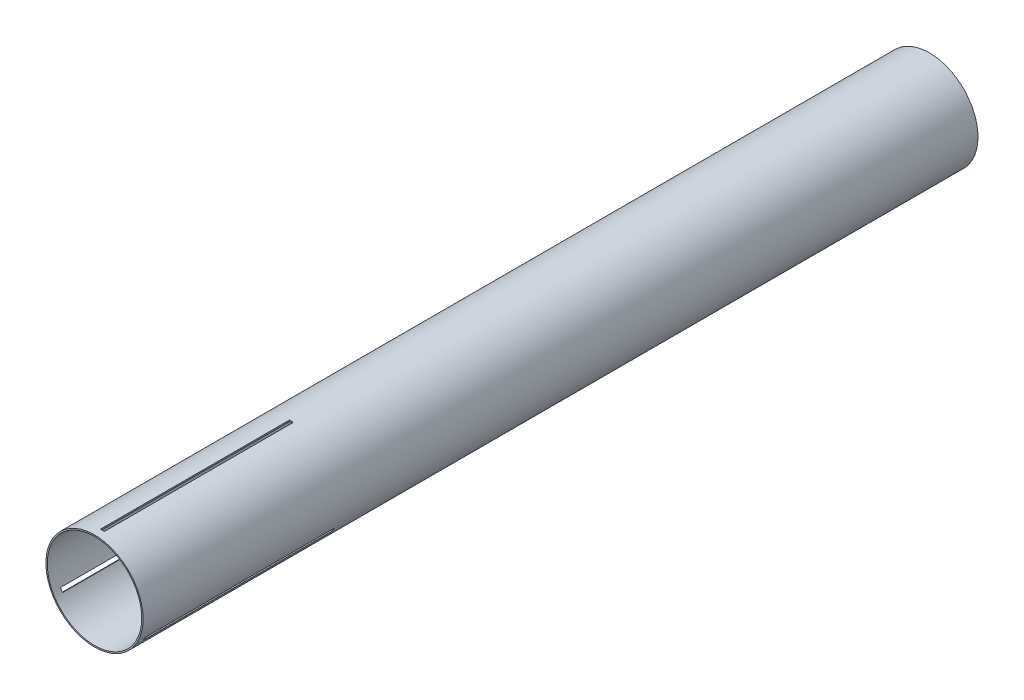
ISO-10303-21;
HEADER;
FILE_DESCRIPTION(('STEP AP214'),'2;1');
FILE_NAME('part.step','',(''),(''),'','','');
FILE_SCHEMA(('AUTOMOTIVE_DESIGN { 1 0 10303 214 1 1 1 1 }'));
ENDSEC;
DATA;
#1=APPLICATION_CONTEXT('core data for automotive mechanical design processes');
#2=APPLICATION_PROTOCOL_DEFINITION('international standard','automotive_design',2000,#1);
#3=PRODUCT_CONTEXT('',#1,'mechanical');
#4=PRODUCT('Part','Part','',(#3));
#5=PRODUCT_RELATED_PRODUCT_CATEGORY('part','',(#4));
#6=PRODUCT_DEFINITION_FORMATION('','',#4);
#7=PRODUCT_DEFINITION_CONTEXT('part definition',#1,'design');
#8=PRODUCT_DEFINITION('design','',#6,#7);
#9=PRODUCT_DEFINITION_SHAPE('','',#8);
#10=(LENGTH_UNIT() NAMED_UNIT(*) SI_UNIT(.MILLI.,.METRE.));
#11=(NAMED_UNIT(*) PLANE_ANGLE_UNIT() SI_UNIT($,.RADIAN.));
#12=(NAMED_UNIT(*) SI_UNIT($,.STERADIAN.) SOLID_ANGLE_UNIT());
#13=UNCERTAINTY_MEASURE_WITH_UNIT(LENGTH_MEASURE(1.E-05),#10,'distance_accuracy_value','');
#14=(GEOMETRIC_REPRESENTATION_CONTEXT(3) GLOBAL_UNCERTAINTY_ASSIGNED_CONTEXT((#13)) GLOBAL_UNIT_ASSIGNED_CONTEXT((#10,
#11,#12)) REPRESENTATION_CONTEXT('',''));
#15=CARTESIAN_POINT('',(0.,0.,0.));
#16=DIRECTION('',(0.,0.,1.));
#17=DIRECTION('',(1.,0.,0.));
#18=AXIS2_PLACEMENT_3D('',#15,#16,#17);
#19=CARTESIAN_POINT('',(0.,0.,1346.2));
#20=DIRECTION('',(0.,0.,-1.));
#21=DIRECTION('',(-1.,0.,0.));
#22=AXIS2_PLACEMENT_3D('',#19,#20,#21);
#23=CYLINDRICAL_SURFACE('',#22,78.359);
#24=DIRECTION('',(0.,0.,-1.));
#25=VECTOR('',#24,1.);
#26=CARTESIAN_POINT('',(66.2176560871294,-41.8969557763647,1346.2));
#27=LINE('',#26,#25);
#28=CARTESIAN_POINT('',(66.2176560871293,-41.8969557763647,1028.7));
#29=VERTEX_POINT('',#28);
#30=CARTESIAN_POINT('',(66.2176560871293,-41.8969557763647,1333.5));
#31=VERTEX_POINT('',#30);
#32=EDGE_CURVE('E159',#29,#31,#27,.F.);
#33=ORIENTED_EDGE('',*,*,#32,.T.);
#34=CARTESIAN_POINT('',(0.,0.,1333.5));
#35=DIRECTION('',(0.,0.,1.));
#36=DIRECTION('',(1.,0.,0.));
#37=AXIS2_PLACEMENT_3D('',#34,#35,#36);
#38=CIRCLE('',#37,78.359);
#39=CARTESIAN_POINT('',(69.3926560871294,-36.3976944623336,1333.5));
#40=VERTEX_POINT('',#39);
#41=EDGE_CURVE('E149',#31,#40,#38,.T.);
#42=ORIENTED_EDGE('',*,*,#41,.T.);
#43=DIRECTION('',(0.,0.,-1.));
#44=VECTOR('',#43,1.);
#45=CARTESIAN_POINT('',(69.3926560871294,-36.3976944623336,1346.2));
#46=LINE('',#45,#44);
#47=CARTESIAN_POINT('',(69.3926560871294,-36.3976944623336,1028.7));
#48=VERTEX_POINT('',#47);
#49=EDGE_CURVE('E157',#48,#40,#46,.F.);
#50=ORIENTED_EDGE('',*,*,#49,.F.);
#51=CARTESIAN_POINT('',(0.,0.,1028.7));
#52=DIRECTION('',(0.,0.,1.));
#53=DIRECTION('',(1.,0.,0.));
#54=AXIS2_PLACEMENT_3D('',#51,#52,#53);
#55=CIRCLE('',#54,78.359);
#56=EDGE_CURVE('E150',#29,#48,#55,.T.);
#57=ORIENTED_EDGE('',*,*,#56,.F.);
#58=EDGE_LOOP('',(#33,#42,#50,#57));
#59=FACE_BOUND('',#58,.T.);
#60=DIRECTION('',(0.,0.,-1.));
#61=VECTOR('',#60,1.);
#62=CARTESIAN_POINT('',(-3.175,78.2946502386977,1346.2));
#63=LINE('',#62,#61);
#64=CARTESIAN_POINT('',(-3.175,78.2946502386977,1028.7));
#65=VERTEX_POINT('',#64);
#66=CARTESIAN_POINT('',(-3.175,78.2946502386977,1333.5));
#67=VERTEX_POINT('',#66);
#68=EDGE_CURVE('E181',#65,#67,#63,.F.);
#69=ORIENTED_EDGE('',*,*,#68,.F.);
#70=CARTESIAN_POINT('',(0.,0.,1028.7));
#71=DIRECTION('',(0.,0.,1.));
#72=DIRECTION('',(1.,0.,0.));
#73=AXIS2_PLACEMENT_3D('',#70,#71,#72);
#74=CIRCLE('',#73,78.359);
#75=CARTESIAN_POINT('',(3.175,78.2946502386977,1028.7));
#76=VERTEX_POINT('',#75);
#77=EDGE_CURVE('E173',#76,#65,#74,.T.);
#78=ORIENTED_EDGE('',*,*,#77,.F.);
#79=DIRECTION('',(0.,0.,-1.));
#80=VECTOR('',#79,1.);
#81=CARTESIAN_POINT('',(3.175,78.2946502386977,1346.2));
#82=LINE('',#81,#80);
#83=CARTESIAN_POINT('',(3.175,78.2946502386977,1333.5));
#84=VERTEX_POINT('',#83);
#85=EDGE_CURVE('E175',#76,#84,#82,.F.);
#86=ORIENTED_EDGE('',*,*,#85,.T.);
#87=CARTESIAN_POINT('',(0.,0.,1333.5));
#88=DIRECTION('',(0.,0.,1.));
#89=DIRECTION('',(1.,0.,0.));
#90=AXIS2_PLACEMENT_3D('',#87,#88,#89);
#91=CIRCLE('',#90,78.359);
#92=EDGE_CURVE('E178',#84,#67,#91,.T.);
#93=ORIENTED_EDGE('',*,*,#92,.T.);
#94=EDGE_LOOP('',(#69,#78,#86,#93));
#95=FACE_BOUND('',#94,.T.);
#96=CARTESIAN_POINT('',(0.,0.,1346.2));
#97=DIRECTION('',(0.,0.,1.));
#98=DIRECTION('',(1.,0.,0.));
#99=AXIS2_PLACEMENT_3D('',#96,#97,#98);
#100=CIRCLE('',#99,78.359);
#101=CARTESIAN_POINT('',(78.359,0.,1346.2));
#102=VERTEX_POINT('',#101);
#103=EDGE_CURVE('E190',#102,#102,#100,.T.);
#104=ORIENTED_EDGE('',*,*,#103,.F.);
#105=EDGE_LOOP('',(#104));
#106=FACE_BOUND('',#105,.T.);
#107=CARTESIAN_POINT('',(0.,0.,0.));
#108=DIRECTION('',(0.,0.,1.));
#109=DIRECTION('',(1.,0.,0.));
#110=AXIS2_PLACEMENT_3D('',#107,#108,#109);
#111=CIRCLE('',#110,78.359);
#112=CARTESIAN_POINT('',(78.359,0.,0.));
#113=VERTEX_POINT('',#112);
#114=EDGE_CURVE('E187',#113,#113,#111,.T.);
#115=ORIENTED_EDGE('',*,*,#114,.T.);
#116=EDGE_LOOP('',(#115));
#117=FACE_BOUND('',#116,.T.);
#118=DIRECTION('',(0.,0.,-1.));
#119=VECTOR('',#118,1.);
#120=CARTESIAN_POINT('',(-66.2176560871299,-41.8969557763638,1346.2));
#121=LINE('',#120,#119);
#122=CARTESIAN_POINT('',(-66.2176560871299,-41.8969557763638,1028.7));
#123=VERTEX_POINT('',#122);
#124=CARTESIAN_POINT('',(-66.2176560871299,-41.8969557763638,1333.5));
#125=VERTEX_POINT('',#124);
#126=EDGE_CURVE('E135',#123,#125,#121,.F.);
#127=ORIENTED_EDGE('',*,*,#126,.F.);
#128=CARTESIAN_POINT('',(-69.3926560871299,-36.3976944623326,1028.7));
#129=VERTEX_POINT('',#128);
#130=EDGE_CURVE('E141',#129,#123,#55,.T.);
#131=ORIENTED_EDGE('',*,*,#130,.F.);
#132=DIRECTION('',(0.,0.,-1.));
#133=VECTOR('',#132,1.);
#134=CARTESIAN_POINT('',(-69.3926560871299,-36.3976944623326,1346.2));
#135=LINE('',#134,#133);
#136=CARTESIAN_POINT('',(-69.3926560871299,-36.3976944623326,1333.5));
#137=VERTEX_POINT('',#136);
#138=EDGE_CURVE('E127',#129,#137,#135,.F.);
#139=ORIENTED_EDGE('',*,*,#138,.T.);
#140=EDGE_CURVE('E153',#137,#125,#38,.T.);
#141=ORIENTED_EDGE('',*,*,#140,.T.);
#142=EDGE_LOOP('',(#127,#131,#139,#141));
#143=FACE_BOUND('',#142,.T.);
#144=ADVANCED_FACE('F40',(#59,#95,#106,#117,#143),#23,.T.);
#145=CARTESIAN_POINT('',(0.,0.,1346.2));
#146=DIRECTION('',(0.,0.,-1.));
#147=DIRECTION('',(-1.,0.,0.));
#148=AXIS2_PLACEMENT_3D('',#145,#146,#147);
#149=CYLINDRICAL_SURFACE('',#148,76.2);
#150=CARTESIAN_POINT('',(0.,0.,1333.5));
#151=DIRECTION('',(0.,0.,1.));
#152=DIRECTION('',(1.,0.,0.));
#153=AXIS2_PLACEMENT_3D('',#150,#151,#152);
#154=CIRCLE('',#153,76.2);
#155=CARTESIAN_POINT('',(64.346326911912,-40.8165433733106,1333.5));
#156=VERTEX_POINT('',#155);
#157=CARTESIAN_POINT('',(67.5213269119121,-35.3172820592794,1333.5));
#158=VERTEX_POINT('',#157);
#159=EDGE_CURVE('E11',#156,#158,#154,.T.);
#160=ORIENTED_EDGE('',*,*,#159,.F.);
#161=DIRECTION('',(0.,0.,-1.));
#162=VECTOR('',#161,1.);
#163=CARTESIAN_POINT('',(64.346326911912,-40.8165433733106,1346.2));
#164=LINE('',#163,#162);
#165=CARTESIAN_POINT('',(64.346326911912,-40.8165433733106,1028.7));
#166=VERTEX_POINT('',#165);
#167=EDGE_CURVE('E43',#166,#156,#164,.F.);
#168=ORIENTED_EDGE('',*,*,#167,.F.);
#169=CARTESIAN_POINT('',(0.,0.,1028.7));
#170=DIRECTION('',(0.,0.,1.));
#171=DIRECTION('',(1.,0.,0.));
#172=AXIS2_PLACEMENT_3D('',#169,#170,#171);
#173=CIRCLE('',#172,76.2);
#174=CARTESIAN_POINT('',(67.5213269119121,-35.3172820592794,1028.7));
#175=VERTEX_POINT('',#174);
#176=EDGE_CURVE('E207',#166,#175,#173,.T.);
#177=ORIENTED_EDGE('',*,*,#176,.T.);
#178=DIRECTION('',(0.,0.,-1.));
#179=VECTOR('',#178,1.);
#180=CARTESIAN_POINT('',(67.5213269119121,-35.3172820592794,1346.2));
#181=LINE('',#180,#179);
#182=EDGE_CURVE('E211',#175,#158,#181,.F.);
#183=ORIENTED_EDGE('',*,*,#182,.T.);
#184=EDGE_LOOP('',(#160,#168,#177,#183));
#185=FACE_BOUND('',#184,.T.);
#186=CARTESIAN_POINT('',(0.,0.,1346.2));
#187=DIRECTION('',(0.,0.,1.));
#188=DIRECTION('',(1.,0.,0.));
#189=AXIS2_PLACEMENT_3D('',#186,#187,#188);
#190=CIRCLE('',#189,76.2);
#191=CARTESIAN_POINT('',(76.2,0.,1346.2));
#192=VERTEX_POINT('',#191);
#193=EDGE_CURVE('E184',#192,#192,#190,.T.);
#194=ORIENTED_EDGE('',*,*,#193,.T.);
#195=EDGE_LOOP('',(#194));
#196=FACE_BOUND('',#195,.T.);
#197=CARTESIAN_POINT('',(0.,0.,0.));
#198=DIRECTION('',(0.,0.,1.));
#199=DIRECTION('',(1.,0.,0.));
#200=AXIS2_PLACEMENT_3D('',#197,#198,#199);
#201=CIRCLE('',#200,76.2);
#202=CARTESIAN_POINT('',(76.2,0.,0.));
#203=VERTEX_POINT('',#202);
#204=EDGE_CURVE('E183',#203,#203,#201,.T.);
#205=ORIENTED_EDGE('',*,*,#204,.F.);
#206=EDGE_LOOP('',(#205));
#207=FACE_BOUND('',#206,.T.);
#208=CARTESIAN_POINT('',(0.,0.,1028.7));
#209=DIRECTION('',(0.,0.,1.));
#210=DIRECTION('',(1.,0.,0.));
#211=AXIS2_PLACEMENT_3D('',#208,#209,#210);
#212=CIRCLE('',#211,76.2);
#213=CARTESIAN_POINT('',(3.175,76.1338254325894,1028.7));
#214=VERTEX_POINT('',#213);
#215=CARTESIAN_POINT('',(-3.175,76.1338254325894,1028.7));
#216=VERTEX_POINT('',#215);
#217=EDGE_CURVE('E193',#214,#216,#212,.T.);
#218=ORIENTED_EDGE('',*,*,#217,.T.);
#219=DIRECTION('',(0.,0.,-1.));
#220=VECTOR('',#219,1.);
#221=CARTESIAN_POINT('',(-3.175,76.1338254325894,1346.2));
#222=LINE('',#221,#220);
#223=CARTESIAN_POINT('',(-3.175,76.1338254325894,1333.5));
#224=VERTEX_POINT('',#223);
#225=EDGE_CURVE('E202',#216,#224,#222,.F.);
#226=ORIENTED_EDGE('',*,*,#225,.T.);
#227=CARTESIAN_POINT('',(0.,0.,1333.5));
#228=DIRECTION('',(0.,0.,1.));
#229=DIRECTION('',(1.,0.,0.));
#230=AXIS2_PLACEMENT_3D('',#227,#228,#229);
#231=CIRCLE('',#230,76.2);
#232=CARTESIAN_POINT('',(3.175,76.1338254325894,1333.5));
#233=VERTEX_POINT('',#232);
#234=EDGE_CURVE('E200',#233,#224,#231,.T.);
#235=ORIENTED_EDGE('',*,*,#234,.F.);
#236=DIRECTION('',(0.,0.,-1.));
#237=VECTOR('',#236,1.);
#238=CARTESIAN_POINT('',(3.175,76.1338254325894,1346.2));
#239=LINE('',#238,#237);
#240=EDGE_CURVE('E198',#214,#233,#239,.F.);
#241=ORIENTED_EDGE('',*,*,#240,.F.);
#242=EDGE_LOOP('',(#218,#226,#235,#241));
#243=FACE_BOUND('',#242,.T.);
#244=CARTESIAN_POINT('',(-67.5213269119126,-35.3172820592785,1028.7));
#245=VERTEX_POINT('',#244);
#246=CARTESIAN_POINT('',(-64.3463269119126,-40.8165433733097,1028.7));
#247=VERTEX_POINT('',#246);
#248=EDGE_CURVE('E144',#245,#247,#173,.T.);
#249=ORIENTED_EDGE('',*,*,#248,.T.);
#250=DIRECTION('',(0.,0.,-1.));
#251=VECTOR('',#250,1.);
#252=CARTESIAN_POINT('',(-64.3463269119126,-40.8165433733097,1346.2));
#253=LINE('',#252,#251);
#254=CARTESIAN_POINT('',(-64.3463269119126,-40.8165433733097,1333.5));
#255=VERTEX_POINT('',#254);
#256=EDGE_CURVE('E209',#247,#255,#253,.F.);
#257=ORIENTED_EDGE('',*,*,#256,.T.);
#258=CARTESIAN_POINT('',(-67.5213269119126,-35.3172820592785,1333.5));
#259=VERTEX_POINT('',#258);
#260=EDGE_CURVE('E49',#259,#255,#154,.T.);
#261=ORIENTED_EDGE('',*,*,#260,.F.);
#262=DIRECTION('',(0.,0.,-1.));
#263=VECTOR('',#262,1.);
#264=CARTESIAN_POINT('',(-67.5213269119126,-35.3172820592785,1346.2));
#265=LINE('',#264,#263);
#266=EDGE_CURVE('E205',#245,#259,#265,.F.);
#267=ORIENTED_EDGE('',*,*,#266,.F.);
#268=EDGE_LOOP('',(#249,#257,#261,#267));
#269=FACE_BOUND('',#268,.T.);
#270=ADVANCED_FACE('F218',(#185,#196,#207,#243,#269),#149,.F.);
#271=CARTESIAN_POINT('',(0.,0.,1346.2));
#272=DIRECTION('',(0.,0.,1.));
#273=DIRECTION('',(1.,0.,0.));
#274=AXIS2_PLACEMENT_3D('',#271,#272,#273);
#275=PLANE('',#274);
#276=ORIENTED_EDGE('',*,*,#103,.T.);
#277=EDGE_LOOP('',(#276));
#278=FACE_BOUND('',#277,.T.);
#279=ORIENTED_EDGE('',*,*,#193,.F.);
#280=EDGE_LOOP('',(#279));
#281=FACE_BOUND('',#280,.T.);
#282=ADVANCED_FACE('F256',(#278,#281),#275,.T.);
#283=CARTESIAN_POINT('',(0.,0.,0.));
#284=DIRECTION('',(0.,0.,1.));
#285=DIRECTION('',(1.,0.,0.));
#286=AXIS2_PLACEMENT_3D('',#283,#284,#285);
#287=PLANE('',#286);
#288=ORIENTED_EDGE('',*,*,#114,.F.);
#289=EDGE_LOOP('',(#288));
#290=FACE_BOUND('',#289,.T.);
#291=ORIENTED_EDGE('',*,*,#204,.T.);
#292=EDGE_LOOP('',(#291));
#293=FACE_BOUND('',#292,.T.);
#294=ADVANCED_FACE('F252',(#290,#293),#287,.F.);
#295=CARTESIAN_POINT('',(-3.175,152.4,1028.7));
#296=DIRECTION('',(1.,0.,0.));
#297=DIRECTION('',(0.,0.,-1.));
#298=AXIS2_PLACEMENT_3D('',#295,#296,#297);
#299=PLANE('',#298);
#300=ORIENTED_EDGE('',*,*,#68,.T.);
#301=DIRECTION('',(0.,-1.,0.));
#302=VECTOR('',#301,1.);
#303=CARTESIAN_POINT('',(-3.175,152.4,1333.5));
#304=LINE('',#303,#302);
#305=EDGE_CURVE('E170',#67,#224,#304,.T.);
#306=ORIENTED_EDGE('',*,*,#305,.T.);
#307=ORIENTED_EDGE('',*,*,#225,.F.);
#308=DIRECTION('',(0.,-1.,0.));
#309=VECTOR('',#308,1.);
#310=CARTESIAN_POINT('',(-3.175,152.4,1028.7));
#311=LINE('',#310,#309);
#312=EDGE_CURVE('E162',#65,#216,#311,.T.);
#313=ORIENTED_EDGE('',*,*,#312,.F.);
#314=EDGE_LOOP('',(#300,#306,#307,#313));
#315=FACE_BOUND('',#314,.T.);
#316=ADVANCED_FACE('F255',(#315),#299,.T.);
#317=CARTESIAN_POINT('',(3.175,152.4,1333.5));
#318=DIRECTION('',(0.,0.,1.));
#319=DIRECTION('',(1.,0.,0.));
#320=AXIS2_PLACEMENT_3D('',#317,#318,#319);
#321=PLANE('',#320);
#322=DIRECTION('',(0.,-1.,0.));
#323=VECTOR('',#322,1.);
#324=CARTESIAN_POINT('',(3.175,152.4,1333.5));
#325=LINE('',#324,#323);
#326=EDGE_CURVE('E167',#84,#233,#325,.T.);
#327=ORIENTED_EDGE('',*,*,#326,.T.);
#328=ORIENTED_EDGE('',*,*,#234,.T.);
#329=ORIENTED_EDGE('',*,*,#305,.F.);
#330=ORIENTED_EDGE('',*,*,#92,.F.);
#331=EDGE_LOOP('',(#327,#328,#329,#330));
#332=FACE_BOUND('',#331,.T.);
#333=ADVANCED_FACE('F295',(#332),#321,.F.);
#334=CARTESIAN_POINT('',(3.175,152.4,1028.7));
#335=DIRECTION('',(1.,0.,0.));
#336=DIRECTION('',(0.,0.,-1.));
#337=AXIS2_PLACEMENT_3D('',#334,#335,#336);
#338=PLANE('',#337);
#339=DIRECTION('',(0.,-1.,0.));
#340=VECTOR('',#339,1.);
#341=CARTESIAN_POINT('',(3.175,152.4,1028.7));
#342=LINE('',#341,#340);
#343=EDGE_CURVE('E164',#76,#214,#342,.T.);
#344=ORIENTED_EDGE('',*,*,#343,.T.);
#345=ORIENTED_EDGE('',*,*,#240,.T.);
#346=ORIENTED_EDGE('',*,*,#326,.F.);
#347=ORIENTED_EDGE('',*,*,#85,.F.);
#348=EDGE_LOOP('',(#344,#345,#346,#347));
#349=FACE_BOUND('',#348,.T.);
#350=ADVANCED_FACE('F281',(#349),#338,.F.);
#351=CARTESIAN_POINT('',(3.175,152.4,1028.7));
#352=DIRECTION('',(0.,0.,1.));
#353=DIRECTION('',(1.,0.,0.));
#354=AXIS2_PLACEMENT_3D('',#351,#352,#353);
#355=PLANE('',#354);
#356=ORIENTED_EDGE('',*,*,#77,.T.);
#357=ORIENTED_EDGE('',*,*,#312,.T.);
#358=ORIENTED_EDGE('',*,*,#217,.F.);
#359=ORIENTED_EDGE('',*,*,#343,.F.);
#360=EDGE_LOOP('',(#356,#357,#358,#359));
#361=FACE_BOUND('',#360,.T.);
#362=ADVANCED_FACE('F274',(#361),#355,.T.);
#363=CARTESIAN_POINT('',(-130.394771536749,-78.9496306570144,1028.7));
#364=DIRECTION('',(-0.499999999999992,0.866025403784443,0.));
#365=DIRECTION('',(-0.866025403784443,-0.499999999999992,0.));
#366=AXIS2_PLACEMENT_3D('',#363,#364,#365);
#367=PLANE('',#366);
#368=ORIENTED_EDGE('',*,*,#126,.T.);
#369=DIRECTION('',(0.866025403784443,0.499999999999992,0.));
#370=VECTOR('',#369,1.);
#371=CARTESIAN_POINT('',(-130.394771536749,-78.9496306570144,1333.5));
#372=LINE('',#371,#370);
#373=EDGE_CURVE('E231',#125,#255,#372,.T.);
#374=ORIENTED_EDGE('',*,*,#373,.T.);
#375=ORIENTED_EDGE('',*,*,#256,.F.);
#376=DIRECTION('',(0.866025403784443,0.499999999999992,0.));
#377=VECTOR('',#376,1.);
#378=CARTESIAN_POINT('',(-130.394771536749,-78.9496306570144,1028.7));
#379=LINE('',#378,#377);
#380=EDGE_CURVE('E146',#123,#247,#379,.T.);
#381=ORIENTED_EDGE('',*,*,#380,.F.);
#382=EDGE_LOOP('',(#368,#374,#375,#381));
#383=FACE_BOUND('',#382,.T.);
#384=ADVANCED_FACE('F272',(#383),#367,.T.);
#385=CARTESIAN_POINT('',(-133.569771536749,-73.4503693429832,1028.7));
#386=DIRECTION('',(-0.499999999999992,0.866025403784443,0.));
#387=DIRECTION('',(-0.866025403784443,-0.499999999999992,0.));
#388=AXIS2_PLACEMENT_3D('',#385,#386,#387);
#389=PLANE('',#388);
#390=DIRECTION('',(0.866025403784443,0.499999999999992,0.));
#391=VECTOR('',#390,1.);
#392=CARTESIAN_POINT('',(-133.569771536749,-73.4503693429832,1028.7));
#393=LINE('',#392,#391);
#394=EDGE_CURVE('E130',#129,#245,#393,.T.);
#395=ORIENTED_EDGE('',*,*,#394,.T.);
#396=ORIENTED_EDGE('',*,*,#266,.T.);
#397=DIRECTION('',(0.866025403784443,0.499999999999992,0.));
#398=VECTOR('',#397,1.);
#399=CARTESIAN_POINT('',(-133.569771536749,-73.4503693429832,1333.5));
#400=LINE('',#399,#398);
#401=EDGE_CURVE('E64',#137,#259,#400,.T.);
#402=ORIENTED_EDGE('',*,*,#401,.F.);
#403=ORIENTED_EDGE('',*,*,#138,.F.);
#404=EDGE_LOOP('',(#395,#396,#402,#403));
#405=FACE_BOUND('',#404,.T.);
#406=ADVANCED_FACE('F129',(#405),#389,.F.);
#407=CARTESIAN_POINT('',(130.394771536748,-78.9496306570162,1028.7));
#408=DIRECTION('',(0.,0.,1.));
#409=DIRECTION('',(1.,0.,0.));
#410=AXIS2_PLACEMENT_3D('',#407,#408,#409);
#411=PLANE('',#410);
#412=ORIENTED_EDGE('',*,*,#130,.T.);
#413=ORIENTED_EDGE('',*,*,#380,.T.);
#414=ORIENTED_EDGE('',*,*,#248,.F.);
#415=ORIENTED_EDGE('',*,*,#394,.F.);
#416=EDGE_LOOP('',(#412,#413,#414,#415));
#417=FACE_BOUND('',#416,.T.);
#418=ADVANCED_FACE('F139',(#417),#411,.T.);
#419=CARTESIAN_POINT('',(130.394771536748,-78.9496306570162,1333.5));
#420=DIRECTION('',(0.,0.,1.));
#421=DIRECTION('',(1.,0.,0.));
#422=AXIS2_PLACEMENT_3D('',#419,#420,#421);
#423=PLANE('',#422);
#424=ORIENTED_EDGE('',*,*,#401,.T.);
#425=ORIENTED_EDGE('',*,*,#260,.T.);
#426=ORIENTED_EDGE('',*,*,#373,.F.);
#427=ORIENTED_EDGE('',*,*,#140,.F.);
#428=EDGE_LOOP('',(#424,#425,#426,#427));
#429=FACE_BOUND('',#428,.T.);
#430=ADVANCED_FACE('F266',(#429),#423,.F.);
#431=CARTESIAN_POINT('',(130.394771536748,-78.9496306570162,1028.7));
#432=DIRECTION('',(-0.500000000000004,-0.866025403784436,0.));
#433=DIRECTION('',(0.866025403784436,-0.500000000000004,0.));
#434=AXIS2_PLACEMENT_3D('',#431,#432,#433);
#435=PLANE('',#434);
#436=DIRECTION('',(-0.866025403784436,0.500000000000004,0.));
#437=VECTOR('',#436,1.);
#438=CARTESIAN_POINT('',(130.394771536748,-78.9496306570162,1028.7));
#439=LINE('',#438,#437);
#440=EDGE_CURVE('E56',#29,#166,#439,.T.);
#441=ORIENTED_EDGE('',*,*,#440,.T.);
#442=ORIENTED_EDGE('',*,*,#167,.T.);
#443=DIRECTION('',(-0.866025403784436,0.500000000000004,0.));
#444=VECTOR('',#443,1.);
#445=CARTESIAN_POINT('',(130.394771536748,-78.9496306570162,1333.5));
#446=LINE('',#445,#444);
#447=EDGE_CURVE('E228',#31,#156,#446,.T.);
#448=ORIENTED_EDGE('',*,*,#447,.F.);
#449=ORIENTED_EDGE('',*,*,#32,.F.);
#450=EDGE_LOOP('',(#441,#442,#448,#449));
#451=FACE_BOUND('',#450,.T.);
#452=ADVANCED_FACE('F224',(#451),#435,.F.);
#453=CARTESIAN_POINT('',(133.569771536748,-73.450369342985,1028.7));
#454=DIRECTION('',(-0.500000000000004,-0.866025403784436,0.));
#455=DIRECTION('',(0.866025403784436,-0.500000000000004,0.));
#456=AXIS2_PLACEMENT_3D('',#453,#454,#455);
#457=PLANE('',#456);
#458=ORIENTED_EDGE('',*,*,#49,.T.);
#459=DIRECTION('',(-0.866025403784436,0.500000000000004,0.));
#460=VECTOR('',#459,1.);
#461=CARTESIAN_POINT('',(133.569771536748,-73.450369342985,1333.5));
#462=LINE('',#461,#460);
#463=EDGE_CURVE('E136',#40,#158,#462,.T.);
#464=ORIENTED_EDGE('',*,*,#463,.T.);
#465=ORIENTED_EDGE('',*,*,#182,.F.);
#466=DIRECTION('',(-0.866025403784436,0.500000000000004,0.));
#467=VECTOR('',#466,1.);
#468=CARTESIAN_POINT('',(133.569771536748,-73.450369342985,1028.7));
#469=LINE('',#468,#467);
#470=EDGE_CURVE('E222',#48,#175,#469,.T.);
#471=ORIENTED_EDGE('',*,*,#470,.F.);
#472=EDGE_LOOP('',(#458,#464,#465,#471));
#473=FACE_BOUND('',#472,.T.);
#474=ADVANCED_FACE('F238',(#473),#457,.T.);
#475=ORIENTED_EDGE('',*,*,#447,.T.);
#476=ORIENTED_EDGE('',*,*,#159,.T.);
#477=ORIENTED_EDGE('',*,*,#463,.F.);
#478=ORIENTED_EDGE('',*,*,#41,.F.);
#479=EDGE_LOOP('',(#475,#476,#477,#478));
#480=FACE_BOUND('',#479,.T.);
#481=ADVANCED_FACE('F241',(#480),#423,.F.);
#482=ORIENTED_EDGE('',*,*,#56,.T.);
#483=ORIENTED_EDGE('',*,*,#470,.T.);
#484=ORIENTED_EDGE('',*,*,#176,.F.);
#485=ORIENTED_EDGE('',*,*,#440,.F.);
#486=EDGE_LOOP('',(#482,#483,#484,#485));
#487=FACE_BOUND('',#486,.T.);
#488=ADVANCED_FACE('F220',(#487),#411,.T.);
#489=CLOSED_SHELL('',(#144,#270,#282,#294,#316,#333,#350,#362,#384,#406,#418,#430,#452,#474,
#481,#488));
#490=MANIFOLD_SOLID_BREP('B2',#489);
#491=ADVANCED_BREP_SHAPE_REPRESENTATION('',(#18,#490),#14);
#492=SHAPE_DEFINITION_REPRESENTATION(#9,#491);
ENDSEC;
END-ISO-10303-21;
